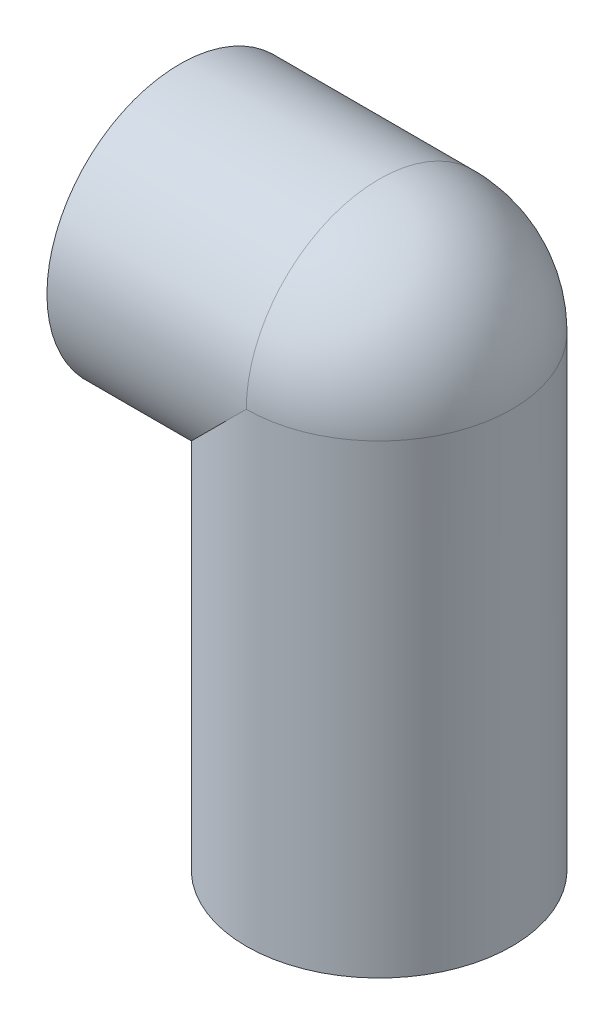
ISO-10303-21;
HEADER;
FILE_DESCRIPTION(('STEP AP214'),'2;1');
FILE_NAME('part.step','',(''),(''),'','','');
FILE_SCHEMA(('AUTOMOTIVE_DESIGN { 1 0 10303 214 1 1 1 1 }'));
ENDSEC;
DATA;
#1=APPLICATION_CONTEXT('core data for automotive mechanical design processes');
#2=APPLICATION_PROTOCOL_DEFINITION('international standard','automotive_design',2000,#1);
#3=PRODUCT_CONTEXT('',#1,'mechanical');
#4=PRODUCT('Part','Part','',(#3));
#5=PRODUCT_RELATED_PRODUCT_CATEGORY('part','',(#4));
#6=PRODUCT_DEFINITION_FORMATION('','',#4);
#7=PRODUCT_DEFINITION_CONTEXT('part definition',#1,'design');
#8=PRODUCT_DEFINITION('design','',#6,#7);
#9=PRODUCT_DEFINITION_SHAPE('','',#8);
#10=(LENGTH_UNIT() NAMED_UNIT(*) SI_UNIT(.MILLI.,.METRE.));
#11=(NAMED_UNIT(*) PLANE_ANGLE_UNIT() SI_UNIT($,.RADIAN.));
#12=(NAMED_UNIT(*) SI_UNIT($,.STERADIAN.) SOLID_ANGLE_UNIT());
#13=UNCERTAINTY_MEASURE_WITH_UNIT(LENGTH_MEASURE(1.E-05),#10,'distance_accuracy_value','');
#14=(GEOMETRIC_REPRESENTATION_CONTEXT(3) GLOBAL_UNCERTAINTY_ASSIGNED_CONTEXT((#13)) GLOBAL_UNIT_ASSIGNED_CONTEXT((#10,
#11,#12)) REPRESENTATION_CONTEXT('',''));
#15=CARTESIAN_POINT('',(0.,0.,0.));
#16=DIRECTION('',(0.,0.,1.));
#17=DIRECTION('',(1.,0.,0.));
#18=AXIS2_PLACEMENT_3D('',#15,#16,#17);
#19=CARTESIAN_POINT('',(30.,180.,0.));
#20=DIRECTION('',(1.,0.,0.));
#21=DIRECTION('',(0.,0.,-1.));
#22=AXIS2_PLACEMENT_3D('',#19,#20,#21);
#23=CYLINDRICAL_SURFACE('',#22,20.);
#24=CARTESIAN_POINT('',(30.,180.,0.));
#25=DIRECTION('',(-1.,0.,0.));
#26=DIRECTION('',(0.,0.,1.));
#27=AXIS2_PLACEMENT_3D('',#24,#25,#26);
#28=CIRCLE('',#27,20.);
#29=CARTESIAN_POINT('',(30.,180.,20.));
#30=VERTEX_POINT('',#29);
#31=EDGE_CURVE('E80',#30,#30,#28,.T.);
#32=ORIENTED_EDGE('',*,*,#31,.F.);
#33=EDGE_LOOP('',(#32));
#34=FACE_BOUND('',#33,.T.);
#35=CARTESIAN_POINT('',(60.,180.,0.));
#36=DIRECTION('',(0.707106781186547,-0.707106781186547,0.));
#37=DIRECTION('',(0.707106781186547,0.707106781186547,0.));
#38=AXIS2_PLACEMENT_3D('',#35,#36,#37);
#39=ELLIPSE('',#38,28.2842712474619,20.);
#40=CARTESIAN_POINT('',(60.,180.,20.));
#41=VERTEX_POINT('',#40);
#42=CARTESIAN_POINT('',(60.,180.,-20.));
#43=VERTEX_POINT('',#42);
#44=EDGE_CURVE('E12',#41,#43,#39,.T.);
#45=ORIENTED_EDGE('',*,*,#44,.F.);
#46=CARTESIAN_POINT('',(60.,180.,0.));
#47=DIRECTION('',(1.,0.,0.));
#48=DIRECTION('',(0.,0.,-1.));
#49=AXIS2_PLACEMENT_3D('',#46,#47,#48);
#50=CIRCLE('',#49,20.);
#51=EDGE_CURVE('E54',#41,#43,#50,.F.);
#52=ORIENTED_EDGE('',*,*,#51,.T.);
#53=EDGE_LOOP('',(#45,#52));
#54=FACE_BOUND('',#53,.T.);
#55=ADVANCED_FACE('F37',(#34,#54),#23,.T.);
#56=CARTESIAN_POINT('',(60.,200.,0.));
#57=DIRECTION('',(0.,-1.,0.));
#58=DIRECTION('',(0.,0.,-1.));
#59=AXIS2_PLACEMENT_3D('',#56,#57,#58);
#60=CYLINDRICAL_SURFACE('',#59,20.);
#61=CARTESIAN_POINT('',(60.,110.,0.));
#62=DIRECTION('',(0.,1.,0.));
#63=DIRECTION('',(0.,0.,1.));
#64=AXIS2_PLACEMENT_3D('',#61,#62,#63);
#65=CIRCLE('',#64,20.);
#66=CARTESIAN_POINT('',(60.,110.,20.));
#67=VERTEX_POINT('',#66);
#68=EDGE_CURVE('E56',#67,#67,#65,.T.);
#69=ORIENTED_EDGE('',*,*,#68,.T.);
#70=EDGE_LOOP('',(#69));
#71=FACE_BOUND('',#70,.T.);
#72=ORIENTED_EDGE('',*,*,#44,.T.);
#73=CARTESIAN_POINT('',(60.,180.,0.));
#74=DIRECTION('',(0.,-1.,0.));
#75=DIRECTION('',(0.,0.,-1.));
#76=AXIS2_PLACEMENT_3D('',#73,#74,#75);
#77=CIRCLE('',#76,20.);
#78=EDGE_CURVE('E45',#43,#41,#77,.T.);
#79=ORIENTED_EDGE('',*,*,#78,.T.);
#80=EDGE_LOOP('',(#72,#79));
#81=FACE_BOUND('',#80,.T.);
#82=ADVANCED_FACE('F58',(#71,#81),#60,.T.);
#83=CARTESIAN_POINT('',(60.,110.,0.));
#84=DIRECTION('',(0.,1.,0.));
#85=DIRECTION('',(0.,0.,1.));
#86=AXIS2_PLACEMENT_3D('',#83,#84,#85);
#87=PLANE('',#86);
#88=ORIENTED_EDGE('',*,*,#68,.F.);
#89=EDGE_LOOP('',(#88));
#90=FACE_BOUND('',#89,.T.);
#91=ADVANCED_FACE('F60',(#90),#87,.F.);
#92=CARTESIAN_POINT('',(60.,180.,0.));
#93=DIRECTION('',(0.,1.,0.));
#94=DIRECTION('',(0.,0.,1.));
#95=AXIS2_PLACEMENT_3D('',#92,#93,#94);
#96=SPHERICAL_SURFACE('',#95,20.);
#97=ORIENTED_EDGE('',*,*,#51,.F.);
#98=ORIENTED_EDGE('',*,*,#78,.F.);
#99=EDGE_LOOP('',(#97,#98));
#100=FACE_BOUND('',#99,.T.);
#101=ADVANCED_FACE('F39',(#100),#96,.T.);
#102=CARTESIAN_POINT('',(30.,180.,0.));
#103=DIRECTION('',(-1.,0.,0.));
#104=DIRECTION('',(0.,0.,1.));
#105=AXIS2_PLACEMENT_3D('',#102,#103,#104);
#106=PLANE('',#105);
#107=ORIENTED_EDGE('',*,*,#31,.T.);
#108=EDGE_LOOP('',(#107));
#109=FACE_BOUND('',#108,.T.);
#110=ADVANCED_FACE('F72',(#109),#106,.T.);
#111=CLOSED_SHELL('',(#55,#82,#91,#101,#110));
#112=MANIFOLD_SOLID_BREP('B2',#111);
#113=ADVANCED_BREP_SHAPE_REPRESENTATION('',(#18,#112),#14);
#114=SHAPE_DEFINITION_REPRESENTATION(#9,#113);
ENDSEC;
END-ISO-10303-21;
